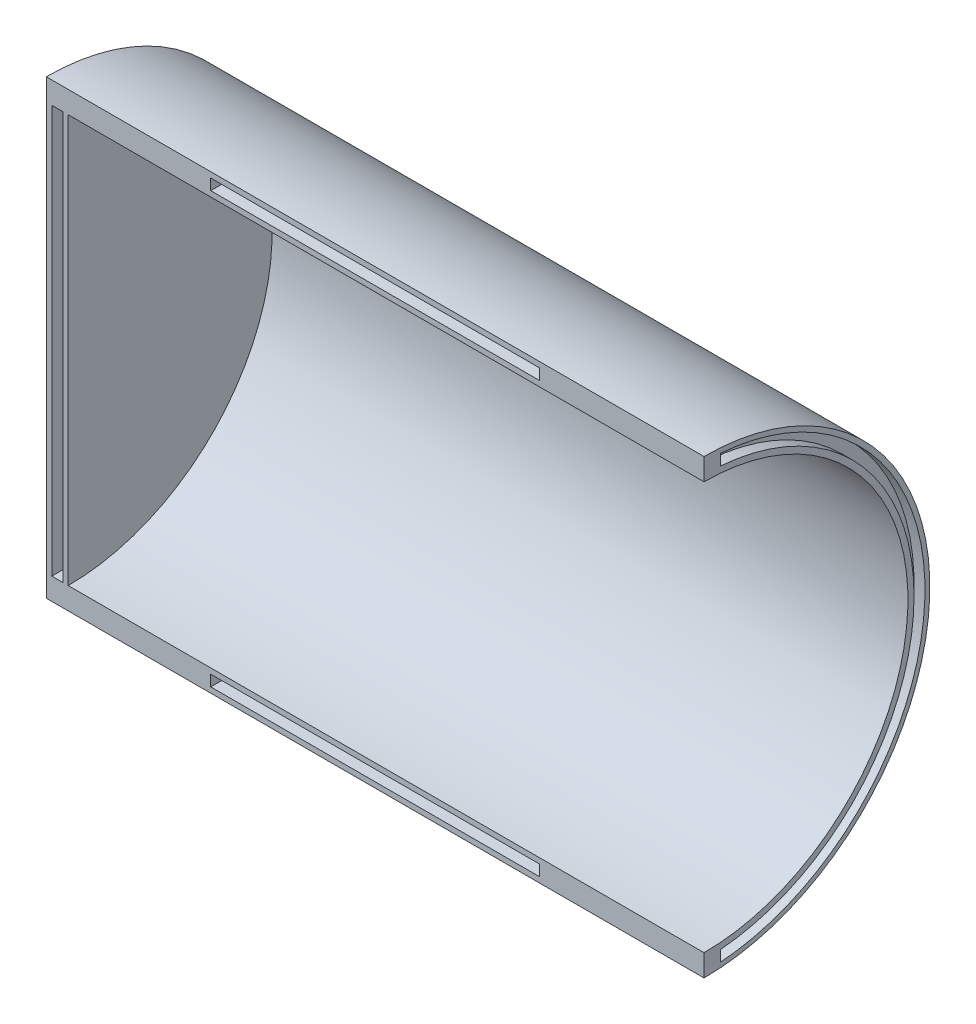
ISO-10303-21;
HEADER;
FILE_DESCRIPTION(('STEP AP214'),'2;1');
FILE_NAME('part.step','',(''),(''),'','','');
FILE_SCHEMA(('AUTOMOTIVE_DESIGN { 1 0 10303 214 1 1 1 1 }'));
ENDSEC;
DATA;
#1=APPLICATION_CONTEXT('core data for automotive mechanical design processes');
#2=APPLICATION_PROTOCOL_DEFINITION('international standard','automotive_design',2000,#1);
#3=PRODUCT_CONTEXT('',#1,'mechanical');
#4=PRODUCT('Part','Part','',(#3));
#5=PRODUCT_RELATED_PRODUCT_CATEGORY('part','',(#4));
#6=PRODUCT_DEFINITION_FORMATION('','',#4);
#7=PRODUCT_DEFINITION_CONTEXT('part definition',#1,'design');
#8=PRODUCT_DEFINITION('design','',#6,#7);
#9=PRODUCT_DEFINITION_SHAPE('','',#8);
#10=(LENGTH_UNIT() NAMED_UNIT(*) SI_UNIT(.MILLI.,.METRE.));
#11=(NAMED_UNIT(*) PLANE_ANGLE_UNIT() SI_UNIT($,.RADIAN.));
#12=(NAMED_UNIT(*) SI_UNIT($,.STERADIAN.) SOLID_ANGLE_UNIT());
#13=UNCERTAINTY_MEASURE_WITH_UNIT(LENGTH_MEASURE(1.E-05),#10,'distance_accuracy_value','');
#14=(GEOMETRIC_REPRESENTATION_CONTEXT(3) GLOBAL_UNCERTAINTY_ASSIGNED_CONTEXT((#13)) GLOBAL_UNIT_ASSIGNED_CONTEXT((#10,
#11,#12)) REPRESENTATION_CONTEXT('',''));
#15=CARTESIAN_POINT('',(0.,0.,0.));
#16=DIRECTION('',(0.,0.,1.));
#17=DIRECTION('',(1.,0.,0.));
#18=AXIS2_PLACEMENT_3D('',#15,#16,#17);
#19=CARTESIAN_POINT('',(0.,0.,0.));
#20=DIRECTION('',(0.,0.,1.));
#21=DIRECTION('',(-1.,0.,0.));
#22=AXIS2_PLACEMENT_3D('',#19,#20,#21);
#23=PLANE('',#22);
#24=DIRECTION('',(-1.,0.,0.));
#25=VECTOR('',#24,1.);
#26=CARTESIAN_POINT('',(3.80999999999997,47.244,0.));
#27=LINE('',#26,#25);
#28=CARTESIAN_POINT('',(3.80999999999997,47.244,0.));
#29=VERTEX_POINT('',#28);
#30=CARTESIAN_POINT('',(1.26999999999997,47.244,-3.2990308874461E-13));
#31=VERTEX_POINT('',#30);
#32=EDGE_CURVE('E228',#29,#31,#27,.T.);
#33=ORIENTED_EDGE('',*,*,#32,.F.);
#34=DIRECTION('',(0.,1.,0.));
#35=VECTOR('',#34,1.);
#36=CARTESIAN_POINT('',(3.81000000000005,-47.244,0.));
#37=LINE('',#36,#35);
#38=CARTESIAN_POINT('',(3.81000000000005,-47.244,0.));
#39=VERTEX_POINT('',#38);
#40=EDGE_CURVE('E255',#39,#29,#37,.T.);
#41=ORIENTED_EDGE('',*,*,#40,.F.);
#42=DIRECTION('',(-1.,0.,0.));
#43=VECTOR('',#42,1.);
#44=CARTESIAN_POINT('',(3.81000000000005,-47.244,0.));
#45=LINE('',#44,#43);
#46=CARTESIAN_POINT('',(1.26999999999995,-47.244,0.));
#47=VERTEX_POINT('',#46);
#48=EDGE_CURVE('E258',#39,#47,#45,.T.);
#49=ORIENTED_EDGE('',*,*,#48,.T.);
#50=DIRECTION('',(0.,1.,0.));
#51=VECTOR('',#50,1.);
#52=CARTESIAN_POINT('',(1.26999999999995,-47.244,0.));
#53=LINE('',#52,#51);
#54=EDGE_CURVE('E262',#47,#31,#53,.T.);
#55=ORIENTED_EDGE('',*,*,#54,.T.);
#56=EDGE_LOOP('',(#33,#41,#49,#55));
#57=FACE_BOUND('',#56,.T.);
#58=DIRECTION('',(0.,-1.,0.));
#59=VECTOR('',#58,1.);
#60=CARTESIAN_POINT('',(38.1,-48.5140000000002,0.));
#61=LINE('',#60,#59);
#62=CARTESIAN_POINT('',(38.1,-48.5140000000002,0.));
#63=VERTEX_POINT('',#62);
#64=CARTESIAN_POINT('',(38.1,-51.0539999999998,3.56508176546594E-13));
#65=VERTEX_POINT('',#64);
#66=EDGE_CURVE('E254',#63,#65,#61,.T.);
#67=ORIENTED_EDGE('',*,*,#66,.F.);
#68=DIRECTION('',(1.,0.,0.));
#69=VECTOR('',#68,1.);
#70=CARTESIAN_POINT('',(38.1,-48.5140000000002,0.));
#71=LINE('',#70,#69);
#72=CARTESIAN_POINT('',(114.3,-48.5140000000002,0.));
#73=VERTEX_POINT('',#72);
#74=EDGE_CURVE('E283',#63,#73,#71,.T.);
#75=ORIENTED_EDGE('',*,*,#74,.T.);
#76=DIRECTION('',(0.,-1.,0.));
#77=VECTOR('',#76,1.);
#78=CARTESIAN_POINT('',(114.3,-48.5140000000002,0.));
#79=LINE('',#78,#77);
#80=CARTESIAN_POINT('',(114.3,-51.0539999999998,0.));
#81=VERTEX_POINT('',#80);
#82=EDGE_CURVE('E286',#73,#81,#79,.T.);
#83=ORIENTED_EDGE('',*,*,#82,.T.);
#84=DIRECTION('',(1.,0.,0.));
#85=VECTOR('',#84,1.);
#86=CARTESIAN_POINT('',(38.1,-51.0539999999998,0.));
#87=LINE('',#86,#85);
#88=EDGE_CURVE('E290',#65,#81,#87,.T.);
#89=ORIENTED_EDGE('',*,*,#88,.F.);
#90=EDGE_LOOP('',(#67,#75,#83,#89));
#91=FACE_BOUND('',#90,.T.);
#92=DIRECTION('',(0.,-1.,0.));
#93=VECTOR('',#92,1.);
#94=CARTESIAN_POINT('',(5.08,-47.244,3.2990308874461E-13));
#95=LINE('',#94,#93);
#96=CARTESIAN_POINT('',(5.08,47.244,0.));
#97=VERTEX_POINT('',#96);
#98=CARTESIAN_POINT('',(5.08,-47.244,3.2990308874461E-13));
#99=VERTEX_POINT('',#98);
#100=EDGE_CURVE('E310',#97,#99,#95,.T.);
#101=ORIENTED_EDGE('',*,*,#100,.F.);
#102=DIRECTION('',(1.,0.,0.));
#103=VECTOR('',#102,1.);
#104=CARTESIAN_POINT('',(152.4,47.244,0.));
#105=LINE('',#104,#103);
#106=CARTESIAN_POINT('',(152.4,47.244,0.));
#107=VERTEX_POINT('',#106);
#108=EDGE_CURVE('E243',#97,#107,#105,.T.);
#109=ORIENTED_EDGE('',*,*,#108,.T.);
#110=DIRECTION('',(0.,1.,0.));
#111=VECTOR('',#110,1.);
#112=CARTESIAN_POINT('',(152.4,52.324,0.));
#113=LINE('',#112,#111);
#114=CARTESIAN_POINT('',(152.4,52.324,0.));
#115=VERTEX_POINT('',#114);
#116=EDGE_CURVE('E304',#107,#115,#113,.T.);
#117=ORIENTED_EDGE('',*,*,#116,.T.);
#118=DIRECTION('',(-1.,0.,0.));
#119=VECTOR('',#118,1.);
#120=CARTESIAN_POINT('',(0.,52.324,0.));
#121=LINE('',#120,#119);
#122=CARTESIAN_POINT('',(0.,52.324,0.));
#123=VERTEX_POINT('',#122);
#124=EDGE_CURVE('E307',#115,#123,#121,.T.);
#125=ORIENTED_EDGE('',*,*,#124,.T.);
#126=DIRECTION('',(0.,1.,0.));
#127=VECTOR('',#126,1.);
#128=CARTESIAN_POINT('',(0.,0.,0.));
#129=LINE('',#128,#127);
#130=CARTESIAN_POINT('',(0.,-52.324,3.65376539147256E-13));
#131=VERTEX_POINT('',#130);
#132=EDGE_CURVE('E322',#131,#123,#129,.T.);
#133=ORIENTED_EDGE('',*,*,#132,.F.);
#134=DIRECTION('',(-1.,0.,0.));
#135=VECTOR('',#134,1.);
#136=CARTESIAN_POINT('',(0.,-52.324,3.65376539147256E-13));
#137=LINE('',#136,#135);
#138=CARTESIAN_POINT('',(152.4,-52.324,3.65376539147256E-13));
#139=VERTEX_POINT('',#138);
#140=EDGE_CURVE('E319',#139,#131,#137,.T.);
#141=ORIENTED_EDGE('',*,*,#140,.F.);
#142=DIRECTION('',(0.,-1.,0.));
#143=VECTOR('',#142,1.);
#144=CARTESIAN_POINT('',(152.4,-52.324,3.65376539147256E-13));
#145=LINE('',#144,#143);
#146=CARTESIAN_POINT('',(152.4,-47.244,3.2990308874461E-13));
#147=VERTEX_POINT('',#146);
#148=EDGE_CURVE('E316',#147,#139,#145,.T.);
#149=ORIENTED_EDGE('',*,*,#148,.F.);
#150=DIRECTION('',(1.,0.,0.));
#151=VECTOR('',#150,1.);
#152=CARTESIAN_POINT('',(152.4,-47.244,3.2990308874461E-13));
#153=LINE('',#152,#151);
#154=EDGE_CURVE('E313',#99,#147,#153,.T.);
#155=ORIENTED_EDGE('',*,*,#154,.F.);
#156=EDGE_LOOP('',(#101,#109,#117,#125,#133,#141,#149,#155));
#157=FACE_BOUND('',#156,.T.);
#158=DIRECTION('',(0.,1.,0.));
#159=VECTOR('',#158,1.);
#160=CARTESIAN_POINT('',(38.1,48.5140000000002,0.));
#161=LINE('',#160,#159);
#162=CARTESIAN_POINT('',(38.1,48.5140000000002,0.));
#163=VERTEX_POINT('',#162);
#164=CARTESIAN_POINT('',(38.1,51.0540000000002,-3.56508176546596E-13));
#165=VERTEX_POINT('',#164);
#166=EDGE_CURVE('E217',#163,#165,#161,.T.);
#167=ORIENTED_EDGE('',*,*,#166,.T.);
#168=DIRECTION('',(1.,0.,0.));
#169=VECTOR('',#168,1.);
#170=CARTESIAN_POINT('',(38.1,51.0540000000002,0.));
#171=LINE('',#170,#169);
#172=CARTESIAN_POINT('',(114.3,51.0539999999998,0.));
#173=VERTEX_POINT('',#172);
#174=EDGE_CURVE('E60',#165,#173,#171,.T.);
#175=ORIENTED_EDGE('',*,*,#174,.T.);
#176=DIRECTION('',(0.,1.,0.));
#177=VECTOR('',#176,1.);
#178=CARTESIAN_POINT('',(114.3,48.5140000000002,0.));
#179=LINE('',#178,#177);
#180=CARTESIAN_POINT('',(114.3,48.5140000000002,0.));
#181=VERTEX_POINT('',#180);
#182=EDGE_CURVE('E227',#181,#173,#179,.T.);
#183=ORIENTED_EDGE('',*,*,#182,.F.);
#184=DIRECTION('',(1.,0.,0.));
#185=VECTOR('',#184,1.);
#186=CARTESIAN_POINT('',(38.1,48.5140000000002,0.));
#187=LINE('',#186,#185);
#188=EDGE_CURVE('E231',#163,#181,#187,.T.);
#189=ORIENTED_EDGE('',*,*,#188,.F.);
#190=EDGE_LOOP('',(#167,#175,#183,#189));
#191=FACE_BOUND('',#190,.T.);
#192=ADVANCED_FACE('F37',(#57,#91,#157,#191),#23,.T.);
#193=CARTESIAN_POINT('',(0.,0.,0.));
#194=DIRECTION('',(-1.,0.,0.));
#195=DIRECTION('',(0.,-1.,0.));
#196=AXIS2_PLACEMENT_3D('',#193,#194,#195);
#197=PLANE('',#196);
#198=CARTESIAN_POINT('',(0.,0.,0.));
#199=DIRECTION('',(1.,0.,0.));
#200=DIRECTION('',(0.,1.,0.));
#201=AXIS2_PLACEMENT_3D('',#198,#199,#200);
#202=CIRCLE('',#201,52.324);
#203=EDGE_CURVE('E11',#131,#123,#202,.T.);
#204=ORIENTED_EDGE('',*,*,#203,.F.);
#205=ORIENTED_EDGE('',*,*,#132,.T.);
#206=EDGE_LOOP('',(#204,#205));
#207=FACE_BOUND('',#206,.T.);
#208=ADVANCED_FACE('F39',(#207),#197,.T.);
#209=CARTESIAN_POINT('',(5.08,0.,0.));
#210=DIRECTION('',(1.,0.,0.));
#211=DIRECTION('',(0.,1.,0.));
#212=AXIS2_PLACEMENT_3D('',#209,#210,#211);
#213=CYLINDRICAL_SURFACE('',#212,52.324);
#214=CARTESIAN_POINT('',(152.4,0.,0.));
#215=DIRECTION('',(1.,0.,0.));
#216=DIRECTION('',(0.,1.,0.));
#217=AXIS2_PLACEMENT_3D('',#214,#215,#216);
#218=CIRCLE('',#217,52.324);
#219=EDGE_CURVE('E45',#139,#115,#218,.T.);
#220=ORIENTED_EDGE('',*,*,#219,.F.);
#221=ORIENTED_EDGE('',*,*,#140,.T.);
#222=ORIENTED_EDGE('',*,*,#203,.T.);
#223=ORIENTED_EDGE('',*,*,#124,.F.);
#224=EDGE_LOOP('',(#220,#221,#222,#223));
#225=FACE_BOUND('',#224,.T.);
#226=ADVANCED_FACE('F339',(#225),#213,.T.);
#227=CARTESIAN_POINT('',(152.4,-52.324,3.65376539147256E-13));
#228=DIRECTION('',(1.,0.,0.));
#229=DIRECTION('',(0.,1.,0.));
#230=AXIS2_PLACEMENT_3D('',#227,#228,#229);
#231=PLANE('',#230);
#232=CARTESIAN_POINT('',(152.4,0.,0.));
#233=DIRECTION('',(1.,0.,0.));
#234=DIRECTION('',(0.,1.,0.));
#235=AXIS2_PLACEMENT_3D('',#232,#233,#234);
#236=CIRCLE('',#235,51.19596679427);
#237=CARTESIAN_POINT('',(152.4,-51.054,-3.81));
#238=VERTEX_POINT('',#237);
#239=CARTESIAN_POINT('',(152.4,51.054,-3.81));
#240=VERTEX_POINT('',#239);
#241=EDGE_CURVE('E52',#238,#240,#236,.T.);
#242=ORIENTED_EDGE('',*,*,#241,.F.);
#243=DIRECTION('',(0.,-1.,0.));
#244=VECTOR('',#243,1.);
#245=CARTESIAN_POINT('',(152.4,-51.054,-3.81));
#246=LINE('',#245,#244);
#247=CARTESIAN_POINT('',(152.4,-48.514,-3.80999999999999));
#248=VERTEX_POINT('',#247);
#249=EDGE_CURVE('E195',#248,#238,#246,.T.);
#250=ORIENTED_EDGE('',*,*,#249,.F.);
#251=CARTESIAN_POINT('',(152.4,0.,0.));
#252=DIRECTION('',(-1.,0.,0.));
#253=DIRECTION('',(0.,1.,0.));
#254=AXIS2_PLACEMENT_3D('',#251,#252,#253);
#255=CIRCLE('',#254,48.6633773591599);
#256=CARTESIAN_POINT('',(152.4,48.514,-3.81));
#257=VERTEX_POINT('',#256);
#258=EDGE_CURVE('E198',#257,#248,#255,.T.);
#259=ORIENTED_EDGE('',*,*,#258,.F.);
#260=DIRECTION('',(0.,-1.,0.));
#261=VECTOR('',#260,1.);
#262=CARTESIAN_POINT('',(152.4,51.054,-3.81));
#263=LINE('',#262,#261);
#264=EDGE_CURVE('E204',#240,#257,#263,.T.);
#265=ORIENTED_EDGE('',*,*,#264,.F.);
#266=EDGE_LOOP('',(#242,#250,#259,#265));
#267=FACE_BOUND('',#266,.T.);
#268=CARTESIAN_POINT('',(152.4,0.,0.));
#269=DIRECTION('',(1.,0.,0.));
#270=DIRECTION('',(0.,1.,0.));
#271=AXIS2_PLACEMENT_3D('',#268,#269,#270);
#272=CIRCLE('',#271,47.244);
#273=EDGE_CURVE('E327',#147,#107,#272,.T.);
#274=ORIENTED_EDGE('',*,*,#273,.F.);
#275=ORIENTED_EDGE('',*,*,#148,.T.);
#276=ORIENTED_EDGE('',*,*,#219,.T.);
#277=ORIENTED_EDGE('',*,*,#116,.F.);
#278=EDGE_LOOP('',(#274,#275,#276,#277));
#279=FACE_BOUND('',#278,.T.);
#280=ADVANCED_FACE('F330',(#267,#279),#231,.T.);
#281=CARTESIAN_POINT('',(5.08,0.,0.));
#282=DIRECTION('',(1.,0.,0.));
#283=DIRECTION('',(0.,1.,0.));
#284=AXIS2_PLACEMENT_3D('',#281,#282,#283);
#285=CYLINDRICAL_SURFACE('',#284,47.244);
#286=CARTESIAN_POINT('',(5.08,0.,0.));
#287=DIRECTION('',(1.,0.,0.));
#288=DIRECTION('',(0.,1.,0.));
#289=AXIS2_PLACEMENT_3D('',#286,#287,#288);
#290=CIRCLE('',#289,47.244);
#291=EDGE_CURVE('E324',#99,#97,#290,.T.);
#292=ORIENTED_EDGE('',*,*,#291,.F.);
#293=ORIENTED_EDGE('',*,*,#154,.T.);
#294=ORIENTED_EDGE('',*,*,#273,.T.);
#295=ORIENTED_EDGE('',*,*,#108,.F.);
#296=EDGE_LOOP('',(#292,#293,#294,#295));
#297=FACE_BOUND('',#296,.T.);
#298=ADVANCED_FACE('F343',(#297),#285,.F.);
#299=CARTESIAN_POINT('',(5.08,-47.244,3.2990308874461E-13));
#300=DIRECTION('',(1.,0.,0.));
#301=DIRECTION('',(0.,1.,0.));
#302=AXIS2_PLACEMENT_3D('',#299,#300,#301);
#303=PLANE('',#302);
#304=ORIENTED_EDGE('',*,*,#100,.T.);
#305=ORIENTED_EDGE('',*,*,#291,.T.);
#306=EDGE_LOOP('',(#304,#305));
#307=FACE_BOUND('',#306,.T.);
#308=ADVANCED_FACE('F345',(#307),#303,.T.);
#309=CARTESIAN_POINT('',(38.1,-48.5140000000002,-2.54));
#310=DIRECTION('',(-1.,0.,0.));
#311=DIRECTION('',(0.,-1.,0.));
#312=AXIS2_PLACEMENT_3D('',#309,#310,#311);
#313=PLANE('',#312);
#314=ORIENTED_EDGE('',*,*,#66,.T.);
#315=DIRECTION('',(0.,0.,1.));
#316=VECTOR('',#315,1.);
#317=CARTESIAN_POINT('',(38.1,-51.0539999999998,-2.54));
#318=LINE('',#317,#316);
#319=CARTESIAN_POINT('',(38.1,-51.0539999999998,-2.54));
#320=VERTEX_POINT('',#319);
#321=EDGE_CURVE('E274',#320,#65,#318,.T.);
#322=ORIENTED_EDGE('',*,*,#321,.F.);
#323=DIRECTION('',(0.,-1.,0.));
#324=VECTOR('',#323,1.);
#325=CARTESIAN_POINT('',(38.1,-48.5140000000002,-2.54));
#326=LINE('',#325,#324);
#327=CARTESIAN_POINT('',(38.1,-48.5140000000002,-2.54));
#328=VERTEX_POINT('',#327);
#329=EDGE_CURVE('E287',#328,#320,#326,.T.);
#330=ORIENTED_EDGE('',*,*,#329,.F.);
#331=DIRECTION('',(0.,0.,1.));
#332=VECTOR('',#331,1.);
#333=CARTESIAN_POINT('',(38.1,-48.5140000000002,-2.54));
#334=LINE('',#333,#332);
#335=EDGE_CURVE('E210',#328,#63,#334,.T.);
#336=ORIENTED_EDGE('',*,*,#335,.T.);
#337=EDGE_LOOP('',(#314,#322,#330,#336));
#338=FACE_BOUND('',#337,.T.);
#339=ADVANCED_FACE('F347',(#338),#313,.F.);
#340=CARTESIAN_POINT('',(38.1,-48.5140000000002,-2.54));
#341=DIRECTION('',(0.,-1.,0.));
#342=DIRECTION('',(0.,0.,-1.));
#343=AXIS2_PLACEMENT_3D('',#340,#341,#342);
#344=PLANE('',#343);
#345=ORIENTED_EDGE('',*,*,#74,.F.);
#346=ORIENTED_EDGE('',*,*,#335,.F.);
#347=DIRECTION('',(1.,0.,0.));
#348=VECTOR('',#347,1.);
#349=CARTESIAN_POINT('',(38.1,-48.5140000000002,-2.54));
#350=LINE('',#349,#348);
#351=CARTESIAN_POINT('',(114.3,-48.5140000000002,-2.54));
#352=VERTEX_POINT('',#351);
#353=EDGE_CURVE('E277',#328,#352,#350,.T.);
#354=ORIENTED_EDGE('',*,*,#353,.T.);
#355=DIRECTION('',(0.,0.,1.));
#356=VECTOR('',#355,1.);
#357=CARTESIAN_POINT('',(114.3,-48.5140000000002,-2.54));
#358=LINE('',#357,#356);
#359=EDGE_CURVE('E280',#352,#73,#358,.T.);
#360=ORIENTED_EDGE('',*,*,#359,.T.);
#361=EDGE_LOOP('',(#345,#346,#354,#360));
#362=FACE_BOUND('',#361,.T.);
#363=ADVANCED_FACE('F353',(#362),#344,.T.);
#364=CARTESIAN_POINT('',(114.3,-48.5140000000002,-2.54));
#365=DIRECTION('',(-1.,0.,0.));
#366=DIRECTION('',(0.,-1.,0.));
#367=AXIS2_PLACEMENT_3D('',#364,#365,#366);
#368=PLANE('',#367);
#369=ORIENTED_EDGE('',*,*,#82,.F.);
#370=ORIENTED_EDGE('',*,*,#359,.F.);
#371=DIRECTION('',(0.,-1.,0.));
#372=VECTOR('',#371,1.);
#373=CARTESIAN_POINT('',(114.3,-48.5140000000002,-2.54));
#374=LINE('',#373,#372);
#375=CARTESIAN_POINT('',(114.3,-51.0539999999998,-2.54));
#376=VERTEX_POINT('',#375);
#377=EDGE_CURVE('E295',#352,#376,#374,.T.);
#378=ORIENTED_EDGE('',*,*,#377,.T.);
#379=DIRECTION('',(0.,0.,1.));
#380=VECTOR('',#379,1.);
#381=CARTESIAN_POINT('',(114.3,-51.0539999999998,-2.54));
#382=LINE('',#381,#380);
#383=EDGE_CURVE('E278',#376,#81,#382,.T.);
#384=ORIENTED_EDGE('',*,*,#383,.T.);
#385=EDGE_LOOP('',(#369,#370,#378,#384));
#386=FACE_BOUND('',#385,.T.);
#387=ADVANCED_FACE('F374',(#386),#368,.T.);
#388=CARTESIAN_POINT('',(38.1,-51.0539999999998,-2.54));
#389=DIRECTION('',(0.,-1.,0.));
#390=DIRECTION('',(0.,0.,-1.));
#391=AXIS2_PLACEMENT_3D('',#388,#389,#390);
#392=PLANE('',#391);
#393=ORIENTED_EDGE('',*,*,#88,.T.);
#394=ORIENTED_EDGE('',*,*,#383,.F.);
#395=DIRECTION('',(1.,0.,0.));
#396=VECTOR('',#395,1.);
#397=CARTESIAN_POINT('',(38.1,-51.0539999999998,-2.54));
#398=LINE('',#397,#396);
#399=EDGE_CURVE('E297',#320,#376,#398,.T.);
#400=ORIENTED_EDGE('',*,*,#399,.F.);
#401=ORIENTED_EDGE('',*,*,#321,.T.);
#402=EDGE_LOOP('',(#393,#394,#400,#401));
#403=FACE_BOUND('',#402,.T.);
#404=ADVANCED_FACE('F370',(#403),#392,.F.);
#405=CARTESIAN_POINT('',(0.,0.,-2.54));
#406=DIRECTION('',(0.,0.,1.));
#407=DIRECTION('',(1.,0.,0.));
#408=AXIS2_PLACEMENT_3D('',#405,#406,#407);
#409=PLANE('',#408);
#410=ORIENTED_EDGE('',*,*,#329,.T.);
#411=ORIENTED_EDGE('',*,*,#399,.T.);
#412=ORIENTED_EDGE('',*,*,#377,.F.);
#413=ORIENTED_EDGE('',*,*,#353,.F.);
#414=EDGE_LOOP('',(#410,#411,#412,#413));
#415=FACE_BOUND('',#414,.T.);
#416=ADVANCED_FACE('F366',(#415),#409,.T.);
#417=CARTESIAN_POINT('',(3.80999999999997,47.244,-2.54));
#418=DIRECTION('',(0.,1.,0.));
#419=DIRECTION('',(0.,0.,1.));
#420=AXIS2_PLACEMENT_3D('',#417,#418,#419);
#421=PLANE('',#420);
#422=ORIENTED_EDGE('',*,*,#32,.T.);
#423=DIRECTION('',(0.,0.,1.));
#424=VECTOR('',#423,1.);
#425=CARTESIAN_POINT('',(1.26999999999997,47.244,-2.54));
#426=LINE('',#425,#424);
#427=CARTESIAN_POINT('',(1.26999999999997,47.244,-2.54));
#428=VERTEX_POINT('',#427);
#429=EDGE_CURVE('E244',#428,#31,#426,.T.);
#430=ORIENTED_EDGE('',*,*,#429,.F.);
#431=DIRECTION('',(-1.,0.,0.));
#432=VECTOR('',#431,1.);
#433=CARTESIAN_POINT('',(3.80999999999997,47.244,-2.54));
#434=LINE('',#433,#432);
#435=CARTESIAN_POINT('',(3.80999999999997,47.244,-2.54));
#436=VERTEX_POINT('',#435);
#437=EDGE_CURVE('E259',#436,#428,#434,.T.);
#438=ORIENTED_EDGE('',*,*,#437,.F.);
#439=DIRECTION('',(0.,0.,1.));
#440=VECTOR('',#439,1.);
#441=CARTESIAN_POINT('',(3.80999999999997,47.244,-2.54));
#442=LINE('',#441,#440);
#443=EDGE_CURVE('E252',#436,#29,#442,.T.);
#444=ORIENTED_EDGE('',*,*,#443,.T.);
#445=EDGE_LOOP('',(#422,#430,#438,#444));
#446=FACE_BOUND('',#445,.T.);
#447=ADVANCED_FACE('F369',(#446),#421,.F.);
#448=CARTESIAN_POINT('',(3.81000000000005,-47.244,-2.54));
#449=DIRECTION('',(1.,0.,0.));
#450=DIRECTION('',(0.,1.,0.));
#451=AXIS2_PLACEMENT_3D('',#448,#449,#450);
#452=PLANE('',#451);
#453=ORIENTED_EDGE('',*,*,#40,.T.);
#454=ORIENTED_EDGE('',*,*,#443,.F.);
#455=DIRECTION('',(0.,1.,0.));
#456=VECTOR('',#455,1.);
#457=CARTESIAN_POINT('',(3.81000000000005,-47.244,-2.54));
#458=LINE('',#457,#456);
#459=CARTESIAN_POINT('',(3.81000000000005,-47.244,-2.54));
#460=VERTEX_POINT('',#459);
#461=EDGE_CURVE('E247',#460,#436,#458,.T.);
#462=ORIENTED_EDGE('',*,*,#461,.F.);
#463=DIRECTION('',(0.,0.,1.));
#464=VECTOR('',#463,1.);
#465=CARTESIAN_POINT('',(3.81000000000005,-47.244,-2.54));
#466=LINE('',#465,#464);
#467=EDGE_CURVE('E250',#460,#39,#466,.T.);
#468=ORIENTED_EDGE('',*,*,#467,.T.);
#469=EDGE_LOOP('',(#453,#454,#462,#468));
#470=FACE_BOUND('',#469,.T.);
#471=ADVANCED_FACE('F388',(#470),#452,.F.);
#472=CARTESIAN_POINT('',(3.81000000000005,-47.244,-2.54));
#473=DIRECTION('',(0.,1.,0.));
#474=DIRECTION('',(0.,0.,1.));
#475=AXIS2_PLACEMENT_3D('',#472,#473,#474);
#476=PLANE('',#475);
#477=ORIENTED_EDGE('',*,*,#48,.F.);
#478=ORIENTED_EDGE('',*,*,#467,.F.);
#479=DIRECTION('',(-1.,0.,0.));
#480=VECTOR('',#479,1.);
#481=CARTESIAN_POINT('',(3.81000000000005,-47.244,-2.54));
#482=LINE('',#481,#480);
#483=CARTESIAN_POINT('',(1.26999999999995,-47.244,-2.54));
#484=VERTEX_POINT('',#483);
#485=EDGE_CURVE('E268',#460,#484,#482,.T.);
#486=ORIENTED_EDGE('',*,*,#485,.T.);
#487=DIRECTION('',(0.,0.,1.));
#488=VECTOR('',#487,1.);
#489=CARTESIAN_POINT('',(1.26999999999995,-47.244,-2.54));
#490=LINE('',#489,#488);
#491=EDGE_CURVE('E248',#484,#47,#490,.T.);
#492=ORIENTED_EDGE('',*,*,#491,.T.);
#493=EDGE_LOOP('',(#477,#478,#486,#492));
#494=FACE_BOUND('',#493,.T.);
#495=ADVANCED_FACE('F391',(#494),#476,.T.);
#496=CARTESIAN_POINT('',(1.26999999999995,-47.244,-2.54));
#497=DIRECTION('',(1.,0.,0.));
#498=DIRECTION('',(0.,1.,0.));
#499=AXIS2_PLACEMENT_3D('',#496,#497,#498);
#500=PLANE('',#499);
#501=ORIENTED_EDGE('',*,*,#54,.F.);
#502=ORIENTED_EDGE('',*,*,#491,.F.);
#503=DIRECTION('',(0.,1.,0.));
#504=VECTOR('',#503,1.);
#505=CARTESIAN_POINT('',(1.26999999999995,-47.244,-2.54));
#506=LINE('',#505,#504);
#507=EDGE_CURVE('E270',#484,#428,#506,.T.);
#508=ORIENTED_EDGE('',*,*,#507,.T.);
#509=ORIENTED_EDGE('',*,*,#429,.T.);
#510=EDGE_LOOP('',(#501,#502,#508,#509));
#511=FACE_BOUND('',#510,.T.);
#512=ADVANCED_FACE('F386',(#511),#500,.T.);
#513=CARTESIAN_POINT('',(0.,0.,-2.54));
#514=DIRECTION('',(0.,0.,-1.));
#515=DIRECTION('',(-1.,0.,0.));
#516=AXIS2_PLACEMENT_3D('',#513,#514,#515);
#517=PLANE('',#516);
#518=ORIENTED_EDGE('',*,*,#437,.T.);
#519=ORIENTED_EDGE('',*,*,#507,.F.);
#520=ORIENTED_EDGE('',*,*,#485,.F.);
#521=ORIENTED_EDGE('',*,*,#461,.T.);
#522=EDGE_LOOP('',(#518,#519,#520,#521));
#523=FACE_BOUND('',#522,.T.);
#524=ADVANCED_FACE('F382',(#523),#517,.F.);
#525=CARTESIAN_POINT('',(38.1,51.0540000000002,-2.54));
#526=DIRECTION('',(0.,-1.,0.));
#527=DIRECTION('',(1.,0.,0.));
#528=AXIS2_PLACEMENT_3D('',#525,#526,#527);
#529=PLANE('',#528);
#530=ORIENTED_EDGE('',*,*,#174,.F.);
#531=DIRECTION('',(0.,0.,1.));
#532=VECTOR('',#531,1.);
#533=CARTESIAN_POINT('',(38.1,51.0540000000002,-2.54));
#534=LINE('',#533,#532);
#535=CARTESIAN_POINT('',(38.1,51.0540000000002,-2.54));
#536=VERTEX_POINT('',#535);
#537=EDGE_CURVE('E225',#536,#165,#534,.T.);
#538=ORIENTED_EDGE('',*,*,#537,.F.);
#539=DIRECTION('',(1.,0.,0.));
#540=VECTOR('',#539,1.);
#541=CARTESIAN_POINT('',(38.1,51.0540000000002,-2.54));
#542=LINE('',#541,#540);
#543=CARTESIAN_POINT('',(114.3,51.0539999999998,-2.54));
#544=VERTEX_POINT('',#543);
#545=EDGE_CURVE('E214',#536,#544,#542,.T.);
#546=ORIENTED_EDGE('',*,*,#545,.T.);
#547=DIRECTION('',(0.,0.,1.));
#548=VECTOR('',#547,1.);
#549=CARTESIAN_POINT('',(114.3,51.0539999999998,-2.54));
#550=LINE('',#549,#548);
#551=EDGE_CURVE('E241',#544,#173,#550,.T.);
#552=ORIENTED_EDGE('',*,*,#551,.T.);
#553=EDGE_LOOP('',(#530,#538,#546,#552));
#554=FACE_BOUND('',#553,.T.);
#555=ADVANCED_FACE('F385',(#554),#529,.T.);
#556=CARTESIAN_POINT('',(114.3,48.5140000000002,-2.54));
#557=DIRECTION('',(1.,0.,0.));
#558=DIRECTION('',(0.,1.,0.));
#559=AXIS2_PLACEMENT_3D('',#556,#557,#558);
#560=PLANE('',#559);
#561=ORIENTED_EDGE('',*,*,#182,.T.);
#562=ORIENTED_EDGE('',*,*,#551,.F.);
#563=DIRECTION('',(0.,1.,0.));
#564=VECTOR('',#563,1.);
#565=CARTESIAN_POINT('',(114.3,48.5140000000002,-2.54));
#566=LINE('',#565,#564);
#567=CARTESIAN_POINT('',(114.3,48.5140000000002,-2.54));
#568=VERTEX_POINT('',#567);
#569=EDGE_CURVE('E216',#568,#544,#566,.T.);
#570=ORIENTED_EDGE('',*,*,#569,.F.);
#571=DIRECTION('',(0.,0.,1.));
#572=VECTOR('',#571,1.);
#573=CARTESIAN_POINT('',(114.3,48.5140000000002,-2.54));
#574=LINE('',#573,#572);
#575=EDGE_CURVE('E239',#568,#181,#574,.T.);
#576=ORIENTED_EDGE('',*,*,#575,.T.);
#577=EDGE_LOOP('',(#561,#562,#570,#576));
#578=FACE_BOUND('',#577,.T.);
#579=ADVANCED_FACE('F404',(#578),#560,.F.);
#580=CARTESIAN_POINT('',(38.1,48.5140000000002,-2.54));
#581=DIRECTION('',(0.,-1.,0.));
#582=DIRECTION('',(1.,0.,0.));
#583=AXIS2_PLACEMENT_3D('',#580,#581,#582);
#584=PLANE('',#583);
#585=ORIENTED_EDGE('',*,*,#188,.T.);
#586=ORIENTED_EDGE('',*,*,#575,.F.);
#587=DIRECTION('',(1.,0.,0.));
#588=VECTOR('',#587,1.);
#589=CARTESIAN_POINT('',(38.1,48.5140000000002,-2.54));
#590=LINE('',#589,#588);
#591=CARTESIAN_POINT('',(38.1,48.5140000000002,-2.54));
#592=VERTEX_POINT('',#591);
#593=EDGE_CURVE('E220',#592,#568,#590,.T.);
#594=ORIENTED_EDGE('',*,*,#593,.F.);
#595=DIRECTION('',(0.,0.,1.));
#596=VECTOR('',#595,1.);
#597=CARTESIAN_POINT('',(38.1,48.5140000000002,-2.54));
#598=LINE('',#597,#596);
#599=EDGE_CURVE('E237',#592,#163,#598,.T.);
#600=ORIENTED_EDGE('',*,*,#599,.T.);
#601=EDGE_LOOP('',(#585,#586,#594,#600));
#602=FACE_BOUND('',#601,.T.);
#603=ADVANCED_FACE('F407',(#602),#584,.F.);
#604=CARTESIAN_POINT('',(38.1,48.5140000000002,-2.54));
#605=DIRECTION('',(1.,0.,0.));
#606=DIRECTION('',(0.,0.,-1.));
#607=AXIS2_PLACEMENT_3D('',#604,#605,#606);
#608=PLANE('',#607);
#609=ORIENTED_EDGE('',*,*,#166,.F.);
#610=ORIENTED_EDGE('',*,*,#599,.F.);
#611=DIRECTION('',(0.,1.,0.));
#612=VECTOR('',#611,1.);
#613=CARTESIAN_POINT('',(38.1,48.5140000000002,-2.54));
#614=LINE('',#613,#612);
#615=EDGE_CURVE('E223',#592,#536,#614,.T.);
#616=ORIENTED_EDGE('',*,*,#615,.T.);
#617=ORIENTED_EDGE('',*,*,#537,.T.);
#618=EDGE_LOOP('',(#609,#610,#616,#617));
#619=FACE_BOUND('',#618,.T.);
#620=ADVANCED_FACE('F411',(#619),#608,.T.);
#621=CARTESIAN_POINT('',(0.,0.,-2.54));
#622=DIRECTION('',(0.,0.,1.));
#623=DIRECTION('',(1.,0.,0.));
#624=AXIS2_PLACEMENT_3D('',#621,#622,#623);
#625=PLANE('',#624);
#626=ORIENTED_EDGE('',*,*,#545,.F.);
#627=ORIENTED_EDGE('',*,*,#615,.F.);
#628=ORIENTED_EDGE('',*,*,#593,.T.);
#629=ORIENTED_EDGE('',*,*,#569,.T.);
#630=EDGE_LOOP('',(#626,#627,#628,#629));
#631=FACE_BOUND('',#630,.T.);
#632=ADVANCED_FACE('F415',(#631),#625,.T.);
#633=CARTESIAN_POINT('',(149.86,0.,0.));
#634=DIRECTION('',(1.,0.,0.));
#635=DIRECTION('',(0.,1.,0.));
#636=AXIS2_PLACEMENT_3D('',#633,#634,#635);
#637=CYLINDRICAL_SURFACE('',#636,51.19596679427);
#638=ORIENTED_EDGE('',*,*,#241,.T.);
#639=DIRECTION('',(1.,0.,0.));
#640=VECTOR('',#639,1.);
#641=CARTESIAN_POINT('',(149.86,51.054,-3.81));
#642=LINE('',#641,#640);
#643=CARTESIAN_POINT('',(149.86,51.054,-3.81));
#644=VERTEX_POINT('',#643);
#645=EDGE_CURVE('E173',#644,#240,#642,.T.);
#646=ORIENTED_EDGE('',*,*,#645,.F.);
#647=CARTESIAN_POINT('',(149.86,0.,0.));
#648=DIRECTION('',(1.,0.,0.));
#649=DIRECTION('',(0.,1.,0.));
#650=AXIS2_PLACEMENT_3D('',#647,#648,#649);
#651=CIRCLE('',#650,51.19596679427);
#652=CARTESIAN_POINT('',(149.86,-51.054,-3.81));
#653=VERTEX_POINT('',#652);
#654=EDGE_CURVE('E177',#653,#644,#651,.T.);
#655=ORIENTED_EDGE('',*,*,#654,.F.);
#656=DIRECTION('',(1.,0.,0.));
#657=VECTOR('',#656,1.);
#658=CARTESIAN_POINT('',(149.86,-51.054,-3.81));
#659=LINE('',#658,#657);
#660=EDGE_CURVE('E208',#653,#238,#659,.T.);
#661=ORIENTED_EDGE('',*,*,#660,.T.);
#662=EDGE_LOOP('',(#638,#646,#655,#661));
#663=FACE_BOUND('',#662,.T.);
#664=ADVANCED_FACE('F175',(#663),#637,.F.);
#665=CARTESIAN_POINT('',(149.86,-51.054,-3.81));
#666=DIRECTION('',(0.,0.,1.));
#667=DIRECTION('',(1.,0.,0.));
#668=AXIS2_PLACEMENT_3D('',#665,#666,#667);
#669=PLANE('',#668);
#670=ORIENTED_EDGE('',*,*,#249,.T.);
#671=ORIENTED_EDGE('',*,*,#660,.F.);
#672=DIRECTION('',(0.,-1.,0.));
#673=VECTOR('',#672,1.);
#674=CARTESIAN_POINT('',(149.86,-51.054,-3.81));
#675=LINE('',#674,#673);
#676=CARTESIAN_POINT('',(149.86,-48.514,-3.80999999999999));
#677=VERTEX_POINT('',#676);
#678=EDGE_CURVE('E183',#677,#653,#675,.T.);
#679=ORIENTED_EDGE('',*,*,#678,.F.);
#680=DIRECTION('',(1.,0.,0.));
#681=VECTOR('',#680,1.);
#682=CARTESIAN_POINT('',(149.86,-48.514,-3.80999999999999));
#683=LINE('',#682,#681);
#684=EDGE_CURVE('E211',#677,#248,#683,.T.);
#685=ORIENTED_EDGE('',*,*,#684,.T.);
#686=EDGE_LOOP('',(#670,#671,#679,#685));
#687=FACE_BOUND('',#686,.T.);
#688=ADVANCED_FACE('F422',(#687),#669,.F.);
#689=CARTESIAN_POINT('',(149.86,0.,0.));
#690=DIRECTION('',(1.,0.,0.));
#691=DIRECTION('',(0.,1.,0.));
#692=AXIS2_PLACEMENT_3D('',#689,#690,#691);
#693=CYLINDRICAL_SURFACE('',#692,48.6633773591599);
#694=ORIENTED_EDGE('',*,*,#258,.T.);
#695=ORIENTED_EDGE('',*,*,#684,.F.);
#696=CARTESIAN_POINT('',(149.86,0.,0.));
#697=DIRECTION('',(-1.,0.,0.));
#698=DIRECTION('',(0.,1.,0.));
#699=AXIS2_PLACEMENT_3D('',#696,#697,#698);
#700=CIRCLE('',#699,48.6633773591599);
#701=CARTESIAN_POINT('',(149.86,48.514,-3.81));
#702=VERTEX_POINT('',#701);
#703=EDGE_CURVE('E191',#702,#677,#700,.T.);
#704=ORIENTED_EDGE('',*,*,#703,.F.);
#705=DIRECTION('',(1.,0.,0.));
#706=VECTOR('',#705,1.);
#707=CARTESIAN_POINT('',(149.86,48.514,-3.81));
#708=LINE('',#707,#706);
#709=EDGE_CURVE('E182',#702,#257,#708,.T.);
#710=ORIENTED_EDGE('',*,*,#709,.T.);
#711=EDGE_LOOP('',(#694,#695,#704,#710));
#712=FACE_BOUND('',#711,.T.);
#713=ADVANCED_FACE('F425',(#712),#693,.T.);
#714=CARTESIAN_POINT('',(149.86,51.054,-3.81));
#715=DIRECTION('',(0.,0.,1.));
#716=DIRECTION('',(1.,0.,0.));
#717=AXIS2_PLACEMENT_3D('',#714,#715,#716);
#718=PLANE('',#717);
#719=ORIENTED_EDGE('',*,*,#264,.T.);
#720=ORIENTED_EDGE('',*,*,#709,.F.);
#721=DIRECTION('',(0.,-1.,0.));
#722=VECTOR('',#721,1.);
#723=CARTESIAN_POINT('',(149.86,51.054,-3.81));
#724=LINE('',#723,#722);
#725=EDGE_CURVE('E186',#644,#702,#724,.T.);
#726=ORIENTED_EDGE('',*,*,#725,.F.);
#727=ORIENTED_EDGE('',*,*,#645,.T.);
#728=EDGE_LOOP('',(#719,#720,#726,#727));
#729=FACE_BOUND('',#728,.T.);
#730=ADVANCED_FACE('F187',(#729),#718,.F.);
#731=CARTESIAN_POINT('',(149.86,0.,0.));
#732=DIRECTION('',(1.,0.,0.));
#733=DIRECTION('',(0.,1.,0.));
#734=AXIS2_PLACEMENT_3D('',#731,#732,#733);
#735=PLANE('',#734);
#736=ORIENTED_EDGE('',*,*,#654,.T.);
#737=ORIENTED_EDGE('',*,*,#725,.T.);
#738=ORIENTED_EDGE('',*,*,#703,.T.);
#739=ORIENTED_EDGE('',*,*,#678,.T.);
#740=EDGE_LOOP('',(#736,#737,#738,#739));
#741=FACE_BOUND('',#740,.T.);
#742=ADVANCED_FACE('F193',(#741),#735,.T.);
#743=CLOSED_SHELL('',(#192,#208,#226,#280,#298,#308,#339,#363,#387,#404,#416,#447,#471,#495,
#512,#524,#555,#579,#603,#620,#632,#664,#688,#713,#730,#742));
#744=MANIFOLD_SOLID_BREP('B2',#743);
#745=ADVANCED_BREP_SHAPE_REPRESENTATION('',(#18,#744),#14);
#746=SHAPE_DEFINITION_REPRESENTATION(#9,#745);
ENDSEC;
END-ISO-10303-21;
